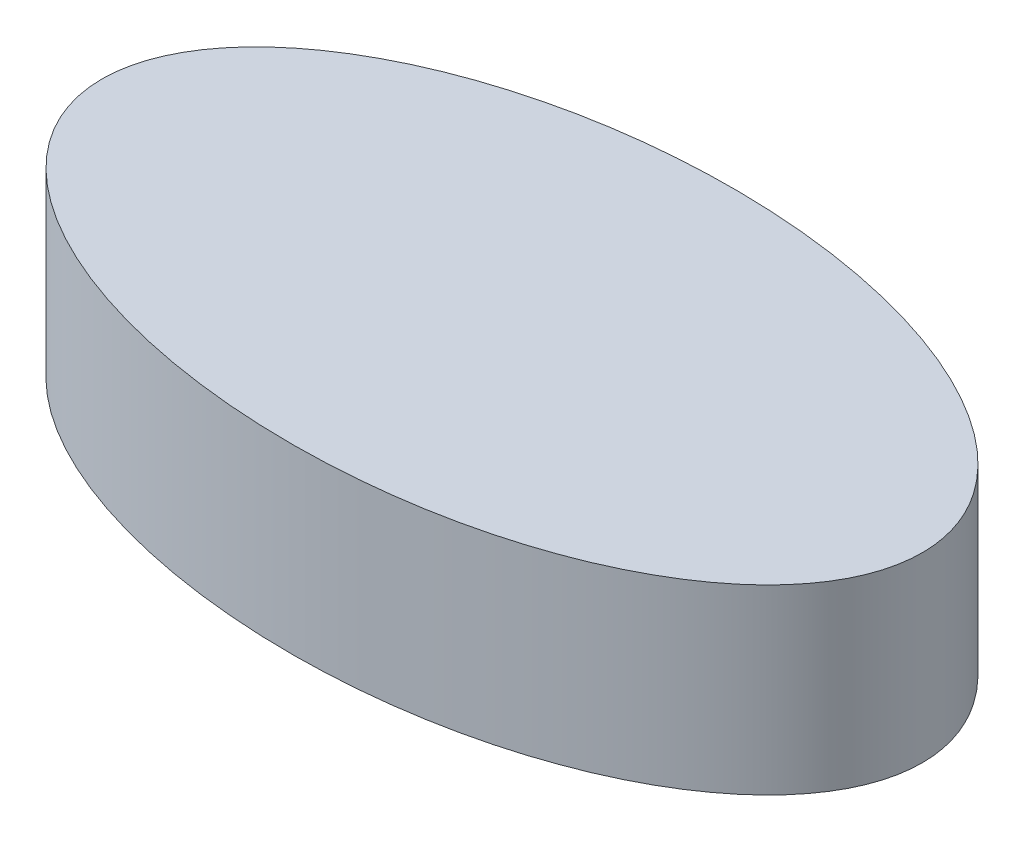
ISO-10303-21;
HEADER;
FILE_DESCRIPTION(('STEP AP214'),'2;1');
FILE_NAME('part.step','',(''),(''),'','','');
FILE_SCHEMA(('AUTOMOTIVE_DESIGN { 1 0 10303 214 1 1 1 1 }'));
ENDSEC;
DATA;
#1=APPLICATION_CONTEXT('core data for automotive mechanical design processes');
#2=APPLICATION_PROTOCOL_DEFINITION('international standard','automotive_design',2000,#1);
#3=PRODUCT_CONTEXT('',#1,'mechanical');
#4=PRODUCT('Part','Part','',(#3));
#5=PRODUCT_RELATED_PRODUCT_CATEGORY('part','',(#4));
#6=PRODUCT_DEFINITION_FORMATION('','',#4);
#7=PRODUCT_DEFINITION_CONTEXT('part definition',#1,'design');
#8=PRODUCT_DEFINITION('design','',#6,#7);
#9=PRODUCT_DEFINITION_SHAPE('','',#8);
#10=(LENGTH_UNIT() NAMED_UNIT(*) SI_UNIT(.MILLI.,.METRE.));
#11=(NAMED_UNIT(*) PLANE_ANGLE_UNIT() SI_UNIT($,.RADIAN.));
#12=(NAMED_UNIT(*) SI_UNIT($,.STERADIAN.) SOLID_ANGLE_UNIT());
#13=UNCERTAINTY_MEASURE_WITH_UNIT(LENGTH_MEASURE(1.E-05),#10,'distance_accuracy_value','');
#14=(GEOMETRIC_REPRESENTATION_CONTEXT(3) GLOBAL_UNCERTAINTY_ASSIGNED_CONTEXT((#13)) GLOBAL_UNIT_ASSIGNED_CONTEXT((#10,
#11,#12)) REPRESENTATION_CONTEXT('',''));
#15=CARTESIAN_POINT('',(0.,0.,0.));
#16=DIRECTION('',(0.,0.,1.));
#17=DIRECTION('',(1.,0.,0.));
#18=AXIS2_PLACEMENT_3D('',#15,#16,#17);
#19=CARTESIAN_POINT('',(0.,150.,0.));
#20=DIRECTION('',(0.,1.,0.));
#21=DIRECTION('',(-1.,0.,0.));
#22=AXIS2_PLACEMENT_3D('',#19,#20,#21);
#23=ELLIPSE('',#22,338.178695974293,182.259434312438);
#24=DIRECTION('',(0.,-1.,0.));
#25=VECTOR('',#24,1.);
#26=SURFACE_OF_LINEAR_EXTRUSION('',#23,#25);
#27=CARTESIAN_POINT('',(-338.178695974293,150.,0.));
#28=VERTEX_POINT('',#27);
#29=EDGE_CURVE('E10',#28,#28,#23,.T.);
#30=ORIENTED_EDGE('',*,*,#29,.F.);
#31=EDGE_LOOP('',(#30));
#32=FACE_BOUND('',#31,.T.);
#33=CARTESIAN_POINT('',(0.,0.,0.));
#34=DIRECTION('',(0.,1.,0.));
#35=DIRECTION('',(-1.,0.,0.));
#36=AXIS2_PLACEMENT_3D('',#33,#34,#35);
#37=ELLIPSE('',#36,338.178695974293,182.259434312438);
#38=CARTESIAN_POINT('',(-338.178695974293,0.,0.));
#39=VERTEX_POINT('',#38);
#40=EDGE_CURVE('E35',#39,#39,#37,.T.);
#41=ORIENTED_EDGE('',*,*,#40,.T.);
#42=EDGE_LOOP('',(#41));
#43=FACE_BOUND('',#42,.T.);
#44=ADVANCED_FACE('F31',(#32,#43),#26,.F.);
#45=CARTESIAN_POINT('',(0.,150.,0.));
#46=DIRECTION('',(0.,1.,0.));
#47=DIRECTION('',(0.,0.,1.));
#48=AXIS2_PLACEMENT_3D('',#45,#46,#47);
#49=PLANE('',#48);
#50=ORIENTED_EDGE('',*,*,#29,.T.);
#51=EDGE_LOOP('',(#50));
#52=FACE_BOUND('',#51,.T.);
#53=ADVANCED_FACE('F56',(#52),#49,.T.);
#54=CARTESIAN_POINT('',(0.,0.,0.));
#55=DIRECTION('',(0.,1.,0.));
#56=DIRECTION('',(0.,0.,1.));
#57=AXIS2_PLACEMENT_3D('',#54,#55,#56);
#58=PLANE('',#57);
#59=CARTESIAN_POINT('',(-162.6,0.,0.));
#60=DIRECTION('',(0.,-1.,0.));
#61=DIRECTION('',(0.,0.,-1.));
#62=AXIS2_PLACEMENT_3D('',#59,#60,#61);
#63=CIRCLE('',#62,60.);
#64=CARTESIAN_POINT('',(-162.6,0.,-60.));
#65=VERTEX_POINT('',#64);
#66=EDGE_CURVE('E46',#65,#65,#63,.T.);
#67=ORIENTED_EDGE('',*,*,#66,.F.);
#68=EDGE_LOOP('',(#67));
#69=FACE_BOUND('',#68,.T.);
#70=CARTESIAN_POINT('',(162.6,0.,0.));
#71=DIRECTION('',(0.,-1.,0.));
#72=DIRECTION('',(0.,0.,-1.));
#73=AXIS2_PLACEMENT_3D('',#70,#71,#72);
#74=CIRCLE('',#73,60.);
#75=CARTESIAN_POINT('',(162.6,0.,-60.));
#76=VERTEX_POINT('',#75);
#77=EDGE_CURVE('E41',#76,#76,#74,.T.);
#78=ORIENTED_EDGE('',*,*,#77,.F.);
#79=EDGE_LOOP('',(#78));
#80=FACE_BOUND('',#79,.T.);
#81=ORIENTED_EDGE('',*,*,#40,.F.);
#82=EDGE_LOOP('',(#81));
#83=FACE_BOUND('',#82,.T.);
#84=ADVANCED_FACE('F52',(#69,#80,#83),#58,.F.);
#85=CARTESIAN_POINT('',(162.6,0.,0.));
#86=DIRECTION('',(0.,-1.,0.));
#87=DIRECTION('',(0.,0.,-1.));
#88=AXIS2_PLACEMENT_3D('',#85,#86,#87);
#89=SPHERICAL_SURFACE('',#88,60.);
#90=ORIENTED_EDGE('',*,*,#77,.T.);
#91=EDGE_LOOP('',(#90));
#92=FACE_BOUND('',#91,.T.);
#93=ADVANCED_FACE('F55',(#92),#89,.F.);
#94=CARTESIAN_POINT('',(-162.6,0.,0.));
#95=DIRECTION('',(0.,-1.,0.));
#96=DIRECTION('',(0.,0.,-1.));
#97=AXIS2_PLACEMENT_3D('',#94,#95,#96);
#98=SPHERICAL_SURFACE('',#97,60.);
#99=ORIENTED_EDGE('',*,*,#66,.T.);
#100=EDGE_LOOP('',(#99));
#101=FACE_BOUND('',#100,.T.);
#102=ADVANCED_FACE('F50',(#101),#98,.F.);
#103=CLOSED_SHELL('',(#44,#53,#84,#93,#102));
#104=MANIFOLD_SOLID_BREP('B2',#103);
#105=ADVANCED_BREP_SHAPE_REPRESENTATION('',(#18,#104),#14);
#106=SHAPE_DEFINITION_REPRESENTATION(#9,#105);
ENDSEC;
END-ISO-10303-21;
